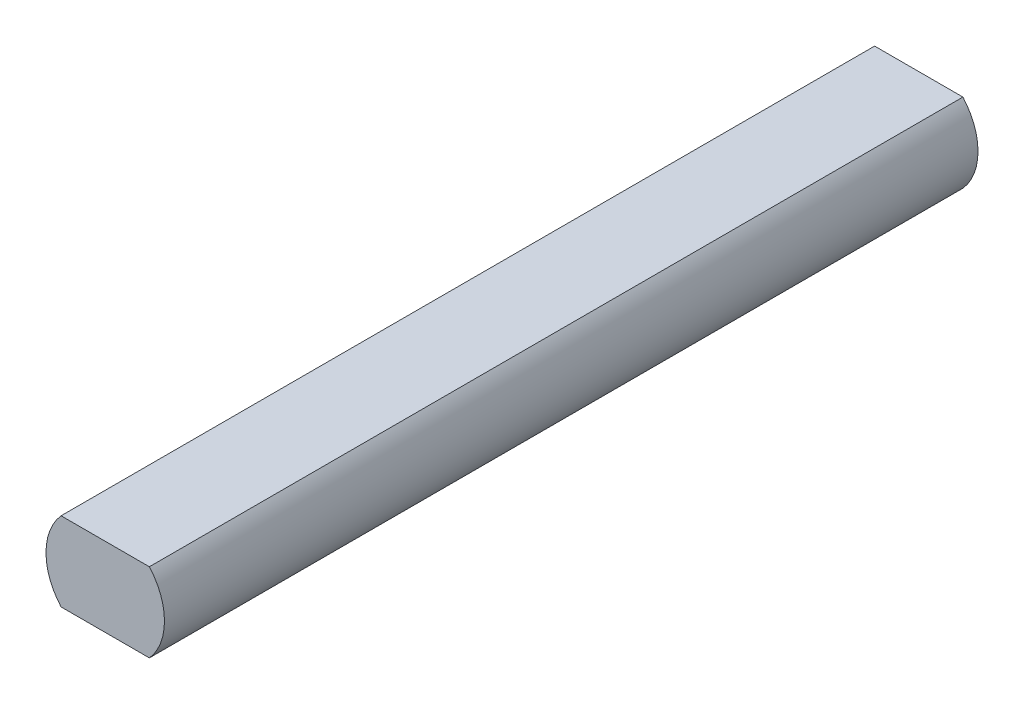
ISO-10303-21;
HEADER;
FILE_DESCRIPTION(('STEP AP214'),'2;1');
FILE_NAME('part.step','',(''),(''),'','','');
FILE_SCHEMA(('AUTOMOTIVE_DESIGN { 1 0 10303 214 1 1 1 1 }'));
ENDSEC;
DATA;
#1=APPLICATION_CONTEXT('core data for automotive mechanical design processes');
#2=APPLICATION_PROTOCOL_DEFINITION('international standard','automotive_design',2000,#1);
#3=PRODUCT_CONTEXT('',#1,'mechanical');
#4=PRODUCT('Part','Part','',(#3));
#5=PRODUCT_RELATED_PRODUCT_CATEGORY('part','',(#4));
#6=PRODUCT_DEFINITION_FORMATION('','',#4);
#7=PRODUCT_DEFINITION_CONTEXT('part definition',#1,'design');
#8=PRODUCT_DEFINITION('design','',#6,#7);
#9=PRODUCT_DEFINITION_SHAPE('','',#8);
#10=(LENGTH_UNIT() NAMED_UNIT(*) SI_UNIT(.MILLI.,.METRE.));
#11=(NAMED_UNIT(*) PLANE_ANGLE_UNIT() SI_UNIT($,.RADIAN.));
#12=(NAMED_UNIT(*) SI_UNIT($,.STERADIAN.) SOLID_ANGLE_UNIT());
#13=UNCERTAINTY_MEASURE_WITH_UNIT(LENGTH_MEASURE(1.E-05),#10,'distance_accuracy_value','');
#14=(GEOMETRIC_REPRESENTATION_CONTEXT(3) GLOBAL_UNCERTAINTY_ASSIGNED_CONTEXT((#13)) GLOBAL_UNIT_ASSIGNED_CONTEXT((#10,
#11,#12)) REPRESENTATION_CONTEXT('',''));
#15=CARTESIAN_POINT('',(0.,0.,0.));
#16=DIRECTION('',(0.,0.,1.));
#17=DIRECTION('',(1.,0.,0.));
#18=AXIS2_PLACEMENT_3D('',#15,#16,#17);
#19=CARTESIAN_POINT('',(0.,0.,18.5115));
#20=DIRECTION('',(0.,0.,-1.));
#21=DIRECTION('',(-1.,0.,0.));
#22=AXIS2_PLACEMENT_3D('',#19,#20,#21);
#23=CYLINDRICAL_SURFACE('',#22,2.69537142857143);
#24=CARTESIAN_POINT('',(0.,0.,-18.5115));
#25=DIRECTION('',(0.,0.,1.));
#26=DIRECTION('',(-1.,0.,0.));
#27=AXIS2_PLACEMENT_3D('',#24,#25,#26);
#28=CIRCLE('',#27,2.69537142857143);
#29=CARTESIAN_POINT('',(2.00923269604296,-1.79666666666667,-18.5115));
#30=VERTEX_POINT('',#29);
#31=CARTESIAN_POINT('',(2.00923269604296,1.79666666666667,-18.5115));
#32=VERTEX_POINT('',#31);
#33=EDGE_CURVE('E95',#30,#32,#28,.T.);
#34=ORIENTED_EDGE('',*,*,#33,.T.);
#35=DIRECTION('',(0.,0.,-1.));
#36=VECTOR('',#35,1.);
#37=CARTESIAN_POINT('',(2.00923269604296,1.79666666666667,18.5115));
#38=LINE('',#37,#36);
#39=CARTESIAN_POINT('',(2.00923269604296,1.79666666666667,18.5115));
#40=VERTEX_POINT('',#39);
#41=EDGE_CURVE('E11',#40,#32,#38,.T.);
#42=ORIENTED_EDGE('',*,*,#41,.F.);
#43=CARTESIAN_POINT('',(0.,0.,18.5115));
#44=DIRECTION('',(0.,0.,1.));
#45=DIRECTION('',(-1.,0.,0.));
#46=AXIS2_PLACEMENT_3D('',#43,#44,#45);
#47=CIRCLE('',#46,2.69537142857143);
#48=CARTESIAN_POINT('',(2.00923269604296,-1.79666666666667,18.5115));
#49=VERTEX_POINT('',#48);
#50=EDGE_CURVE('E83',#49,#40,#47,.T.);
#51=ORIENTED_EDGE('',*,*,#50,.F.);
#52=DIRECTION('',(0.,0.,-1.));
#53=VECTOR('',#52,1.);
#54=CARTESIAN_POINT('',(2.00923269604296,-1.79666666666667,18.5115));
#55=LINE('',#54,#53);
#56=EDGE_CURVE('E91',#49,#30,#55,.T.);
#57=ORIENTED_EDGE('',*,*,#56,.T.);
#58=EDGE_LOOP('',(#34,#42,#51,#57));
#59=FACE_BOUND('',#58,.T.);
#60=ADVANCED_FACE('F32',(#59),#23,.T.);
#61=CARTESIAN_POINT('',(2.00923269604296,1.79666666666667,18.5115));
#62=DIRECTION('',(0.,-1.,0.));
#63=DIRECTION('',(0.,0.,-1.));
#64=AXIS2_PLACEMENT_3D('',#61,#62,#63);
#65=PLANE('',#64);
#66=DIRECTION('',(-1.,0.,0.));
#67=VECTOR('',#66,1.);
#68=CARTESIAN_POINT('',(2.00923269604296,1.79666666666667,-18.5115));
#69=LINE('',#68,#67);
#70=CARTESIAN_POINT('',(-2.00923269604296,1.79666666666667,-18.5115));
#71=VERTEX_POINT('',#70);
#72=EDGE_CURVE('E87',#32,#71,#69,.T.);
#73=ORIENTED_EDGE('',*,*,#72,.T.);
#74=DIRECTION('',(0.,0.,-1.));
#75=VECTOR('',#74,1.);
#76=CARTESIAN_POINT('',(-2.00923269604296,1.79666666666667,18.5115));
#77=LINE('',#76,#75);
#78=CARTESIAN_POINT('',(-2.00923269604296,1.79666666666667,18.5115));
#79=VERTEX_POINT('',#78);
#80=EDGE_CURVE('E40',#79,#71,#77,.T.);
#81=ORIENTED_EDGE('',*,*,#80,.F.);
#82=DIRECTION('',(-1.,0.,0.));
#83=VECTOR('',#82,1.);
#84=CARTESIAN_POINT('',(2.00923269604296,1.79666666666667,18.5115));
#85=LINE('',#84,#83);
#86=EDGE_CURVE('E78',#40,#79,#85,.T.);
#87=ORIENTED_EDGE('',*,*,#86,.F.);
#88=ORIENTED_EDGE('',*,*,#41,.T.);
#89=EDGE_LOOP('',(#73,#81,#87,#88));
#90=FACE_BOUND('',#89,.T.);
#91=ADVANCED_FACE('F86',(#90),#65,.F.);
#92=CARTESIAN_POINT('',(0.,0.,18.5115));
#93=DIRECTION('',(0.,0.,-1.));
#94=DIRECTION('',(-1.,0.,0.));
#95=AXIS2_PLACEMENT_3D('',#92,#93,#94);
#96=CYLINDRICAL_SURFACE('',#95,2.69537142857147);
#97=CARTESIAN_POINT('',(0.,0.,-18.5115));
#98=DIRECTION('',(0.,0.,1.));
#99=DIRECTION('',(-1.,0.,0.));
#100=AXIS2_PLACEMENT_3D('',#97,#98,#99);
#101=CIRCLE('',#100,2.69537142857147);
#102=CARTESIAN_POINT('',(-2.00923269604296,-1.79666666666667,-18.5115));
#103=VERTEX_POINT('',#102);
#104=EDGE_CURVE('E65',#71,#103,#101,.T.);
#105=ORIENTED_EDGE('',*,*,#104,.T.);
#106=DIRECTION('',(0.,0.,-1.));
#107=VECTOR('',#106,1.);
#108=CARTESIAN_POINT('',(-2.00923269604296,-1.79666666666667,18.5115));
#109=LINE('',#108,#107);
#110=CARTESIAN_POINT('',(-2.00923269604296,-1.79666666666667,18.5115));
#111=VERTEX_POINT('',#110);
#112=EDGE_CURVE('E88',#111,#103,#109,.T.);
#113=ORIENTED_EDGE('',*,*,#112,.F.);
#114=CARTESIAN_POINT('',(0.,0.,18.5115));
#115=DIRECTION('',(0.,0.,1.));
#116=DIRECTION('',(-1.,0.,0.));
#117=AXIS2_PLACEMENT_3D('',#114,#115,#116);
#118=CIRCLE('',#117,2.69537142857147);
#119=EDGE_CURVE('E81',#79,#111,#118,.T.);
#120=ORIENTED_EDGE('',*,*,#119,.F.);
#121=ORIENTED_EDGE('',*,*,#80,.T.);
#122=EDGE_LOOP('',(#105,#113,#120,#121));
#123=FACE_BOUND('',#122,.T.);
#124=ADVANCED_FACE('F89',(#123),#96,.T.);
#125=CARTESIAN_POINT('',(-2.00923269604296,-1.79666666666667,18.5115));
#126=DIRECTION('',(0.,1.,0.));
#127=DIRECTION('',(0.,0.,1.));
#128=AXIS2_PLACEMENT_3D('',#125,#126,#127);
#129=PLANE('',#128);
#130=DIRECTION('',(1.,0.,0.));
#131=VECTOR('',#130,1.);
#132=CARTESIAN_POINT('',(-2.00923269604296,-1.79666666666667,-18.5115));
#133=LINE('',#132,#131);
#134=EDGE_CURVE('E71',#103,#30,#133,.T.);
#135=ORIENTED_EDGE('',*,*,#134,.T.);
#136=ORIENTED_EDGE('',*,*,#56,.F.);
#137=DIRECTION('',(1.,0.,0.));
#138=VECTOR('',#137,1.);
#139=CARTESIAN_POINT('',(-2.00923269604296,-1.79666666666667,18.5115));
#140=LINE('',#139,#138);
#141=EDGE_CURVE('E48',#111,#49,#140,.T.);
#142=ORIENTED_EDGE('',*,*,#141,.F.);
#143=ORIENTED_EDGE('',*,*,#112,.T.);
#144=EDGE_LOOP('',(#135,#136,#142,#143));
#145=FACE_BOUND('',#144,.T.);
#146=ADVANCED_FACE('F102',(#145),#129,.F.);
#147=CARTESIAN_POINT('',(0.,0.,18.5115));
#148=DIRECTION('',(0.,0.,-1.));
#149=DIRECTION('',(-1.,0.,0.));
#150=AXIS2_PLACEMENT_3D('',#147,#148,#149);
#151=PLANE('',#150);
#152=ORIENTED_EDGE('',*,*,#50,.T.);
#153=ORIENTED_EDGE('',*,*,#86,.T.);
#154=ORIENTED_EDGE('',*,*,#119,.T.);
#155=ORIENTED_EDGE('',*,*,#141,.T.);
#156=EDGE_LOOP('',(#152,#153,#154,#155));
#157=FACE_BOUND('',#156,.T.);
#158=ADVANCED_FACE('F79',(#157),#151,.F.);
#159=CARTESIAN_POINT('',(0.,0.,-18.5115));
#160=DIRECTION('',(0.,0.,-1.));
#161=DIRECTION('',(-1.,0.,0.));
#162=AXIS2_PLACEMENT_3D('',#159,#160,#161);
#163=PLANE('',#162);
#164=ORIENTED_EDGE('',*,*,#33,.F.);
#165=ORIENTED_EDGE('',*,*,#134,.F.);
#166=ORIENTED_EDGE('',*,*,#104,.F.);
#167=ORIENTED_EDGE('',*,*,#72,.F.);
#168=EDGE_LOOP('',(#164,#165,#166,#167));
#169=FACE_BOUND('',#168,.T.);
#170=ADVANCED_FACE('F105',(#169),#163,.T.);
#171=CLOSED_SHELL('',(#60,#91,#124,#146,#158,#170));
#172=MANIFOLD_SOLID_BREP('B2',#171);
#173=ADVANCED_BREP_SHAPE_REPRESENTATION('',(#18,#172),#14);
#174=SHAPE_DEFINITION_REPRESENTATION(#9,#173);
ENDSEC;
END-ISO-10303-21;
